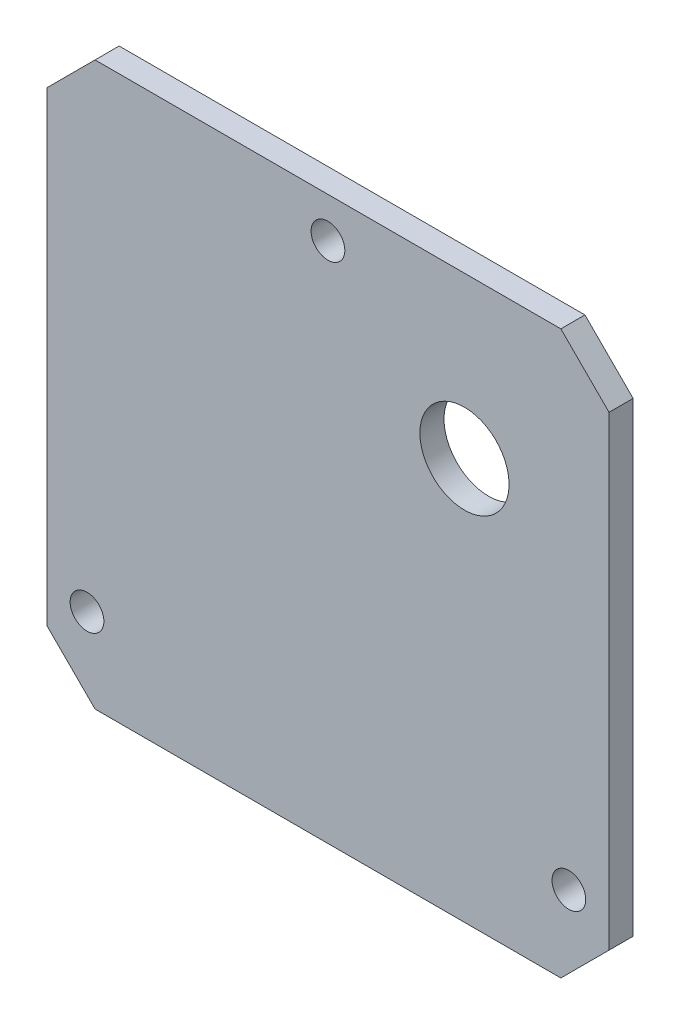
ISO-10303-21;
HEADER;
FILE_DESCRIPTION(('STEP AP214'),'2;1');
FILE_NAME('part.step','',(''),(''),'','','');
FILE_SCHEMA(('AUTOMOTIVE_DESIGN { 1 0 10303 214 1 1 1 1 }'));
ENDSEC;
DATA;
#1=APPLICATION_CONTEXT('core data for automotive mechanical design processes');
#2=APPLICATION_PROTOCOL_DEFINITION('international standard','automotive_design',2000,#1);
#3=PRODUCT_CONTEXT('',#1,'mechanical');
#4=PRODUCT('Part','Part','',(#3));
#5=PRODUCT_RELATED_PRODUCT_CATEGORY('part','',(#4));
#6=PRODUCT_DEFINITION_FORMATION('','',#4);
#7=PRODUCT_DEFINITION_CONTEXT('part definition',#1,'design');
#8=PRODUCT_DEFINITION('design','',#6,#7);
#9=PRODUCT_DEFINITION_SHAPE('','',#8);
#10=(LENGTH_UNIT() NAMED_UNIT(*) SI_UNIT(.MILLI.,.METRE.));
#11=(NAMED_UNIT(*) PLANE_ANGLE_UNIT() SI_UNIT($,.RADIAN.));
#12=(NAMED_UNIT(*) SI_UNIT($,.STERADIAN.) SOLID_ANGLE_UNIT());
#13=UNCERTAINTY_MEASURE_WITH_UNIT(LENGTH_MEASURE(1.E-05),#10,'distance_accuracy_value','');
#14=(GEOMETRIC_REPRESENTATION_CONTEXT(3) GLOBAL_UNCERTAINTY_ASSIGNED_CONTEXT((#13)) GLOBAL_UNIT_ASSIGNED_CONTEXT((#10,
#11,#12)) REPRESENTATION_CONTEXT('',''));
#15=CARTESIAN_POINT('',(0.,0.,0.));
#16=DIRECTION('',(0.,0.,1.));
#17=DIRECTION('',(1.,0.,0.));
#18=AXIS2_PLACEMENT_3D('',#15,#16,#17);
#19=CARTESIAN_POINT('',(-35.,-35.,3.));
#20=DIRECTION('',(1.,0.,0.));
#21=DIRECTION('',(0.,0.,-1.));
#22=AXIS2_PLACEMENT_3D('',#19,#20,#21);
#23=PLANE('',#22);
#24=DIRECTION('',(0.,-1.,0.));
#25=VECTOR('',#24,1.);
#26=CARTESIAN_POINT('',(-35.,-35.,0.));
#27=LINE('',#26,#25);
#28=CARTESIAN_POINT('',(-35.,29.,0.));
#29=VERTEX_POINT('',#28);
#30=CARTESIAN_POINT('',(-35.,-29.,0.));
#31=VERTEX_POINT('',#30);
#32=EDGE_CURVE('E131',#29,#31,#27,.T.);
#33=ORIENTED_EDGE('',*,*,#32,.T.);
#34=DIRECTION('',(0.,0.,1.));
#35=VECTOR('',#34,1.);
#36=CARTESIAN_POINT('',(-35.,-29.,3.));
#37=LINE('',#36,#35);
#38=CARTESIAN_POINT('',(-35.,-29.,3.));
#39=VERTEX_POINT('',#38);
#40=EDGE_CURVE('E109',#31,#39,#37,.T.);
#41=ORIENTED_EDGE('',*,*,#40,.T.);
#42=DIRECTION('',(0.,-1.,0.));
#43=VECTOR('',#42,1.);
#44=CARTESIAN_POINT('',(-35.,-35.,3.));
#45=LINE('',#44,#43);
#46=CARTESIAN_POINT('',(-35.,29.,3.));
#47=VERTEX_POINT('',#46);
#48=EDGE_CURVE('E141',#47,#39,#45,.T.);
#49=ORIENTED_EDGE('',*,*,#48,.F.);
#50=DIRECTION('',(0.,0.,-1.));
#51=VECTOR('',#50,1.);
#52=CARTESIAN_POINT('',(-35.,29.,3.));
#53=LINE('',#52,#51);
#54=EDGE_CURVE('E114',#47,#29,#53,.T.);
#55=ORIENTED_EDGE('',*,*,#54,.T.);
#56=EDGE_LOOP('',(#33,#41,#49,#55));
#57=FACE_BOUND('',#56,.T.);
#58=ADVANCED_FACE('F37',(#57),#23,.F.);
#59=CARTESIAN_POINT('',(35.,-35.,3.));
#60=DIRECTION('',(0.,1.,0.));
#61=DIRECTION('',(-1.,0.,0.));
#62=AXIS2_PLACEMENT_3D('',#59,#60,#61);
#63=PLANE('',#62);
#64=DIRECTION('',(1.,0.,0.));
#65=VECTOR('',#64,1.);
#66=CARTESIAN_POINT('',(35.,-35.,3.));
#67=LINE('',#66,#65);
#68=CARTESIAN_POINT('',(-29.,-35.,3.));
#69=VERTEX_POINT('',#68);
#70=CARTESIAN_POINT('',(29.,-35.,3.));
#71=VERTEX_POINT('',#70);
#72=EDGE_CURVE('E124',#69,#71,#67,.T.);
#73=ORIENTED_EDGE('',*,*,#72,.F.);
#74=DIRECTION('',(0.,0.,-1.));
#75=VECTOR('',#74,1.);
#76=CARTESIAN_POINT('',(-29.,-35.,3.));
#77=LINE('',#76,#75);
#78=CARTESIAN_POINT('',(-29.,-35.,0.));
#79=VERTEX_POINT('',#78);
#80=EDGE_CURVE('E108',#69,#79,#77,.T.);
#81=ORIENTED_EDGE('',*,*,#80,.T.);
#82=DIRECTION('',(1.,0.,0.));
#83=VECTOR('',#82,1.);
#84=CARTESIAN_POINT('',(35.,-35.,0.));
#85=LINE('',#84,#83);
#86=CARTESIAN_POINT('',(29.,-35.,0.));
#87=VERTEX_POINT('',#86);
#88=EDGE_CURVE('E121',#79,#87,#85,.T.);
#89=ORIENTED_EDGE('',*,*,#88,.T.);
#90=DIRECTION('',(0.,0.,1.));
#91=VECTOR('',#90,1.);
#92=CARTESIAN_POINT('',(29.,-35.,3.));
#93=LINE('',#92,#91);
#94=EDGE_CURVE('E126',#87,#71,#93,.T.);
#95=ORIENTED_EDGE('',*,*,#94,.T.);
#96=EDGE_LOOP('',(#73,#81,#89,#95));
#97=FACE_BOUND('',#96,.T.);
#98=ADVANCED_FACE('F120',(#97),#63,.F.);
#99=CARTESIAN_POINT('',(35.,-35.,3.));
#100=DIRECTION('',(-1.,0.,0.));
#101=DIRECTION('',(0.,0.,1.));
#102=AXIS2_PLACEMENT_3D('',#99,#100,#101);
#103=PLANE('',#102);
#104=DIRECTION('',(0.,1.,0.));
#105=VECTOR('',#104,1.);
#106=CARTESIAN_POINT('',(35.,-35.,3.));
#107=LINE('',#106,#105);
#108=CARTESIAN_POINT('',(35.,-29.,3.));
#109=VERTEX_POINT('',#108);
#110=CARTESIAN_POINT('',(35.,29.,3.));
#111=VERTEX_POINT('',#110);
#112=EDGE_CURVE('E167',#109,#111,#107,.T.);
#113=ORIENTED_EDGE('',*,*,#112,.F.);
#114=DIRECTION('',(0.,0.,-1.));
#115=VECTOR('',#114,1.);
#116=CARTESIAN_POINT('',(35.,-29.,3.));
#117=LINE('',#116,#115);
#118=CARTESIAN_POINT('',(35.,-29.,0.));
#119=VERTEX_POINT('',#118);
#120=EDGE_CURVE('E160',#109,#119,#117,.T.);
#121=ORIENTED_EDGE('',*,*,#120,.T.);
#122=DIRECTION('',(0.,1.,0.));
#123=VECTOR('',#122,1.);
#124=CARTESIAN_POINT('',(35.,-35.,0.));
#125=LINE('',#124,#123);
#126=CARTESIAN_POINT('',(35.,29.,0.));
#127=VERTEX_POINT('',#126);
#128=EDGE_CURVE('E130',#119,#127,#125,.T.);
#129=ORIENTED_EDGE('',*,*,#128,.T.);
#130=DIRECTION('',(0.,0.,1.));
#131=VECTOR('',#130,1.);
#132=CARTESIAN_POINT('',(35.,29.,3.));
#133=LINE('',#132,#131);
#134=EDGE_CURVE('E158',#127,#111,#133,.T.);
#135=ORIENTED_EDGE('',*,*,#134,.T.);
#136=EDGE_LOOP('',(#113,#121,#129,#135));
#137=FACE_BOUND('',#136,.T.);
#138=ADVANCED_FACE('F165',(#137),#103,.F.);
#139=CARTESIAN_POINT('',(35.,35.,3.));
#140=DIRECTION('',(0.,-1.,0.));
#141=DIRECTION('',(1.,0.,0.));
#142=AXIS2_PLACEMENT_3D('',#139,#140,#141);
#143=PLANE('',#142);
#144=DIRECTION('',(-1.,0.,0.));
#145=VECTOR('',#144,1.);
#146=CARTESIAN_POINT('',(35.,35.,3.));
#147=LINE('',#146,#145);
#148=CARTESIAN_POINT('',(29.,35.,3.));
#149=VERTEX_POINT('',#148);
#150=CARTESIAN_POINT('',(-29.,35.,3.));
#151=VERTEX_POINT('',#150);
#152=EDGE_CURVE('E142',#149,#151,#147,.T.);
#153=ORIENTED_EDGE('',*,*,#152,.F.);
#154=DIRECTION('',(0.,0.,-1.));
#155=VECTOR('',#154,1.);
#156=CARTESIAN_POINT('',(29.,35.,3.));
#157=LINE('',#156,#155);
#158=CARTESIAN_POINT('',(29.,35.,0.));
#159=VERTEX_POINT('',#158);
#160=EDGE_CURVE('E11',#149,#159,#157,.T.);
#161=ORIENTED_EDGE('',*,*,#160,.T.);
#162=DIRECTION('',(-1.,0.,0.));
#163=VECTOR('',#162,1.);
#164=CARTESIAN_POINT('',(35.,35.,0.));
#165=LINE('',#164,#163);
#166=CARTESIAN_POINT('',(-29.,35.,0.));
#167=VERTEX_POINT('',#166);
#168=EDGE_CURVE('E134',#159,#167,#165,.T.);
#169=ORIENTED_EDGE('',*,*,#168,.T.);
#170=DIRECTION('',(0.,0.,1.));
#171=VECTOR('',#170,1.);
#172=CARTESIAN_POINT('',(-29.,35.,3.));
#173=LINE('',#172,#171);
#174=EDGE_CURVE('E46',#167,#151,#173,.T.);
#175=ORIENTED_EDGE('',*,*,#174,.T.);
#176=EDGE_LOOP('',(#153,#161,#169,#175));
#177=FACE_BOUND('',#176,.T.);
#178=ADVANCED_FACE('F174',(#177),#143,.F.);
#179=CARTESIAN_POINT('',(0.,0.,3.));
#180=DIRECTION('',(0.,0.,1.));
#181=DIRECTION('',(1.,0.,0.));
#182=AXIS2_PLACEMENT_3D('',#179,#180,#181);
#183=PLANE('',#182);
#184=CARTESIAN_POINT('',(17.,15.,3.));
#185=DIRECTION('',(0.,0.,-1.));
#186=DIRECTION('',(-1.,0.,0.));
#187=AXIS2_PLACEMENT_3D('',#184,#185,#186);
#188=CIRCLE('',#187,5.55);
#189=CARTESIAN_POINT('',(11.45,15.,3.));
#190=VERTEX_POINT('',#189);
#191=EDGE_CURVE('E185',#190,#190,#188,.T.);
#192=ORIENTED_EDGE('',*,*,#191,.T.);
#193=EDGE_LOOP('',(#192));
#194=FACE_BOUND('',#193,.T.);
#195=CARTESIAN_POINT('',(0.,30.,3.));
#196=DIRECTION('',(0.,0.,-1.));
#197=DIRECTION('',(-1.,0.,0.));
#198=AXIS2_PLACEMENT_3D('',#195,#196,#197);
#199=CIRCLE('',#198,2.1);
#200=CARTESIAN_POINT('',(-2.09999999999998,30.,3.));
#201=VERTEX_POINT('',#200);
#202=EDGE_CURVE('E136',#201,#201,#199,.T.);
#203=ORIENTED_EDGE('',*,*,#202,.T.);
#204=EDGE_LOOP('',(#203));
#205=FACE_BOUND('',#204,.T.);
#206=CARTESIAN_POINT('',(30.,-25.,3.));
#207=DIRECTION('',(0.,0.,-1.));
#208=DIRECTION('',(-1.,0.,0.));
#209=AXIS2_PLACEMENT_3D('',#206,#207,#208);
#210=CIRCLE('',#209,2.1);
#211=CARTESIAN_POINT('',(27.9,-25.,3.));
#212=VERTEX_POINT('',#211);
#213=EDGE_CURVE('E191',#212,#212,#210,.T.);
#214=ORIENTED_EDGE('',*,*,#213,.T.);
#215=EDGE_LOOP('',(#214));
#216=FACE_BOUND('',#215,.T.);
#217=CARTESIAN_POINT('',(-30.,-25.,3.));
#218=DIRECTION('',(0.,0.,-1.));
#219=DIRECTION('',(-1.,0.,0.));
#220=AXIS2_PLACEMENT_3D('',#217,#218,#219);
#221=CIRCLE('',#220,2.1);
#222=CARTESIAN_POINT('',(-32.1,-25.,3.));
#223=VERTEX_POINT('',#222);
#224=EDGE_CURVE('E184',#223,#223,#221,.T.);
#225=ORIENTED_EDGE('',*,*,#224,.T.);
#226=EDGE_LOOP('',(#225));
#227=FACE_BOUND('',#226,.T.);
#228=ORIENTED_EDGE('',*,*,#48,.T.);
#229=DIRECTION('',(-0.707106781186546,0.707106781186549,0.));
#230=VECTOR('',#229,1.);
#231=CARTESIAN_POINT('',(-32.0000000000001,-31.9999999999999,3.));
#232=LINE('',#231,#230);
#233=EDGE_CURVE('E156',#39,#69,#232,.F.);
#234=ORIENTED_EDGE('',*,*,#233,.T.);
#235=ORIENTED_EDGE('',*,*,#72,.T.);
#236=DIRECTION('',(-0.707106781186549,-0.707106781186546,0.));
#237=VECTOR('',#236,1.);
#238=CARTESIAN_POINT('',(31.9999999999999,-32.0000000000001,3.));
#239=LINE('',#238,#237);
#240=EDGE_CURVE('E154',#71,#109,#239,.F.);
#241=ORIENTED_EDGE('',*,*,#240,.T.);
#242=ORIENTED_EDGE('',*,*,#112,.T.);
#243=DIRECTION('',(0.707106781186546,-0.707106781186549,0.));
#244=VECTOR('',#243,1.);
#245=CARTESIAN_POINT('',(32.0000000000001,31.9999999999999,3.));
#246=LINE('',#245,#244);
#247=EDGE_CURVE('E59',#111,#149,#246,.F.);
#248=ORIENTED_EDGE('',*,*,#247,.T.);
#249=ORIENTED_EDGE('',*,*,#152,.T.);
#250=DIRECTION('',(0.707106781186549,0.707106781186546,0.));
#251=VECTOR('',#250,1.);
#252=CARTESIAN_POINT('',(-31.9999999999999,32.,3.));
#253=LINE('',#252,#251);
#254=EDGE_CURVE('E151',#151,#47,#253,.F.);
#255=ORIENTED_EDGE('',*,*,#254,.T.);
#256=EDGE_LOOP('',(#228,#234,#235,#241,#242,#248,#249,#255));
#257=FACE_BOUND('',#256,.T.);
#258=ADVANCED_FACE('F205',(#194,#205,#216,#227,#257),#183,.T.);
#259=CARTESIAN_POINT('',(0.,0.,0.));
#260=DIRECTION('',(0.,0.,1.));
#261=DIRECTION('',(1.,0.,0.));
#262=AXIS2_PLACEMENT_3D('',#259,#260,#261);
#263=PLANE('',#262);
#264=CARTESIAN_POINT('',(17.,15.,0.));
#265=DIRECTION('',(0.,0.,-1.));
#266=DIRECTION('',(-1.,0.,0.));
#267=AXIS2_PLACEMENT_3D('',#264,#265,#266);
#268=CIRCLE('',#267,5.55);
#269=CARTESIAN_POINT('',(11.45,15.,0.));
#270=VERTEX_POINT('',#269);
#271=EDGE_CURVE('E199',#270,#270,#268,.T.);
#272=ORIENTED_EDGE('',*,*,#271,.F.);
#273=EDGE_LOOP('',(#272));
#274=FACE_BOUND('',#273,.T.);
#275=CARTESIAN_POINT('',(0.,30.,0.));
#276=DIRECTION('',(0.,0.,-1.));
#277=DIRECTION('',(-1.,0.,0.));
#278=AXIS2_PLACEMENT_3D('',#275,#276,#277);
#279=CIRCLE('',#278,2.1);
#280=CARTESIAN_POINT('',(-2.09999999999998,30.,0.));
#281=VERTEX_POINT('',#280);
#282=EDGE_CURVE('E194',#281,#281,#279,.T.);
#283=ORIENTED_EDGE('',*,*,#282,.F.);
#284=EDGE_LOOP('',(#283));
#285=FACE_BOUND('',#284,.T.);
#286=CARTESIAN_POINT('',(30.,-25.,0.));
#287=DIRECTION('',(0.,0.,-1.));
#288=DIRECTION('',(-1.,0.,0.));
#289=AXIS2_PLACEMENT_3D('',#286,#287,#288);
#290=CIRCLE('',#289,2.1);
#291=CARTESIAN_POINT('',(27.9,-25.,0.));
#292=VERTEX_POINT('',#291);
#293=EDGE_CURVE('E188',#292,#292,#290,.T.);
#294=ORIENTED_EDGE('',*,*,#293,.F.);
#295=EDGE_LOOP('',(#294));
#296=FACE_BOUND('',#295,.T.);
#297=CARTESIAN_POINT('',(-30.,-25.,0.));
#298=DIRECTION('',(0.,0.,-1.));
#299=DIRECTION('',(-1.,0.,0.));
#300=AXIS2_PLACEMENT_3D('',#297,#298,#299);
#301=CIRCLE('',#300,2.1);
#302=CARTESIAN_POINT('',(-32.1,-25.,0.));
#303=VERTEX_POINT('',#302);
#304=EDGE_CURVE('E181',#303,#303,#301,.T.);
#305=ORIENTED_EDGE('',*,*,#304,.F.);
#306=EDGE_LOOP('',(#305));
#307=FACE_BOUND('',#306,.T.);
#308=ORIENTED_EDGE('',*,*,#88,.F.);
#309=DIRECTION('',(0.707106781186546,-0.707106781186549,0.));
#310=VECTOR('',#309,1.);
#311=CARTESIAN_POINT('',(-29.,-35.,0.));
#312=LINE('',#311,#310);
#313=EDGE_CURVE('E104',#79,#31,#312,.F.);
#314=ORIENTED_EDGE('',*,*,#313,.T.);
#315=ORIENTED_EDGE('',*,*,#32,.F.);
#316=DIRECTION('',(-0.707106781186549,-0.707106781186546,0.));
#317=VECTOR('',#316,1.);
#318=CARTESIAN_POINT('',(-35.,29.,0.));
#319=LINE('',#318,#317);
#320=EDGE_CURVE('E125',#29,#167,#319,.F.);
#321=ORIENTED_EDGE('',*,*,#320,.T.);
#322=ORIENTED_EDGE('',*,*,#168,.F.);
#323=DIRECTION('',(-0.707106781186546,0.707106781186549,0.));
#324=VECTOR('',#323,1.);
#325=CARTESIAN_POINT('',(29.,35.,0.));
#326=LINE('',#325,#324);
#327=EDGE_CURVE('E145',#159,#127,#326,.F.);
#328=ORIENTED_EDGE('',*,*,#327,.T.);
#329=ORIENTED_EDGE('',*,*,#128,.F.);
#330=DIRECTION('',(0.707106781186549,0.707106781186546,0.));
#331=VECTOR('',#330,1.);
#332=CARTESIAN_POINT('',(35.,-29.,0.));
#333=LINE('',#332,#331);
#334=EDGE_CURVE('E115',#119,#87,#333,.F.);
#335=ORIENTED_EDGE('',*,*,#334,.T.);
#336=EDGE_LOOP('',(#308,#314,#315,#321,#322,#328,#329,#335));
#337=FACE_BOUND('',#336,.T.);
#338=ADVANCED_FACE('F128',(#274,#285,#296,#307,#337),#263,.F.);
#339=CARTESIAN_POINT('',(-29.,-35.,3.));
#340=DIRECTION('',(0.707106781186549,0.707106781186546,0.));
#341=DIRECTION('',(0.,0.,-1.));
#342=AXIS2_PLACEMENT_3D('',#339,#340,#341);
#343=PLANE('',#342);
#344=ORIENTED_EDGE('',*,*,#233,.F.);
#345=ORIENTED_EDGE('',*,*,#40,.F.);
#346=ORIENTED_EDGE('',*,*,#313,.F.);
#347=ORIENTED_EDGE('',*,*,#80,.F.);
#348=EDGE_LOOP('',(#344,#345,#346,#347));
#349=FACE_BOUND('',#348,.T.);
#350=ADVANCED_FACE('F107',(#349),#343,.F.);
#351=CARTESIAN_POINT('',(35.,-29.,3.));
#352=DIRECTION('',(-0.707106781186546,0.707106781186549,0.));
#353=DIRECTION('',(0.,0.,-1.));
#354=AXIS2_PLACEMENT_3D('',#351,#352,#353);
#355=PLANE('',#354);
#356=ORIENTED_EDGE('',*,*,#240,.F.);
#357=ORIENTED_EDGE('',*,*,#94,.F.);
#358=ORIENTED_EDGE('',*,*,#334,.F.);
#359=ORIENTED_EDGE('',*,*,#120,.F.);
#360=EDGE_LOOP('',(#356,#357,#358,#359));
#361=FACE_BOUND('',#360,.T.);
#362=ADVANCED_FACE('F253',(#361),#355,.F.);
#363=CARTESIAN_POINT('',(29.,35.,3.));
#364=DIRECTION('',(-0.707106781186549,-0.707106781186546,0.));
#365=DIRECTION('',(0.,0.,-1.));
#366=AXIS2_PLACEMENT_3D('',#363,#364,#365);
#367=PLANE('',#366);
#368=ORIENTED_EDGE('',*,*,#247,.F.);
#369=ORIENTED_EDGE('',*,*,#134,.F.);
#370=ORIENTED_EDGE('',*,*,#327,.F.);
#371=ORIENTED_EDGE('',*,*,#160,.F.);
#372=EDGE_LOOP('',(#368,#369,#370,#371));
#373=FACE_BOUND('',#372,.T.);
#374=ADVANCED_FACE('F173',(#373),#367,.F.);
#375=CARTESIAN_POINT('',(-35.,29.,3.));
#376=DIRECTION('',(0.707106781186546,-0.707106781186549,0.));
#377=DIRECTION('',(0.,0.,-1.));
#378=AXIS2_PLACEMENT_3D('',#375,#376,#377);
#379=PLANE('',#378);
#380=ORIENTED_EDGE('',*,*,#254,.F.);
#381=ORIENTED_EDGE('',*,*,#174,.F.);
#382=ORIENTED_EDGE('',*,*,#320,.F.);
#383=ORIENTED_EDGE('',*,*,#54,.F.);
#384=EDGE_LOOP('',(#380,#381,#382,#383));
#385=FACE_BOUND('',#384,.T.);
#386=ADVANCED_FACE('F40',(#385),#379,.F.);
#387=CARTESIAN_POINT('',(-30.,-25.,3.));
#388=DIRECTION('',(0.,0.,-1.));
#389=DIRECTION('',(-1.,0.,0.));
#390=AXIS2_PLACEMENT_3D('',#387,#388,#389);
#391=CYLINDRICAL_SURFACE('',#390,2.1);
#392=ORIENTED_EDGE('',*,*,#224,.F.);
#393=EDGE_LOOP('',(#392));
#394=FACE_BOUND('',#393,.T.);
#395=ORIENTED_EDGE('',*,*,#304,.T.);
#396=EDGE_LOOP('',(#395));
#397=FACE_BOUND('',#396,.T.);
#398=ADVANCED_FACE('F224',(#394,#397),#391,.F.);
#399=CARTESIAN_POINT('',(30.,-25.,3.));
#400=DIRECTION('',(0.,0.,-1.));
#401=DIRECTION('',(-1.,0.,0.));
#402=AXIS2_PLACEMENT_3D('',#399,#400,#401);
#403=CYLINDRICAL_SURFACE('',#402,2.1);
#404=ORIENTED_EDGE('',*,*,#213,.F.);
#405=EDGE_LOOP('',(#404));
#406=FACE_BOUND('',#405,.T.);
#407=ORIENTED_EDGE('',*,*,#293,.T.);
#408=EDGE_LOOP('',(#407));
#409=FACE_BOUND('',#408,.T.);
#410=ADVANCED_FACE('F226',(#406,#409),#403,.F.);
#411=CARTESIAN_POINT('',(0.,30.,3.));
#412=DIRECTION('',(0.,0.,-1.));
#413=DIRECTION('',(-1.,0.,0.));
#414=AXIS2_PLACEMENT_3D('',#411,#412,#413);
#415=CYLINDRICAL_SURFACE('',#414,2.1);
#416=ORIENTED_EDGE('',*,*,#202,.F.);
#417=EDGE_LOOP('',(#416));
#418=FACE_BOUND('',#417,.T.);
#419=ORIENTED_EDGE('',*,*,#282,.T.);
#420=EDGE_LOOP('',(#419));
#421=FACE_BOUND('',#420,.T.);
#422=ADVANCED_FACE('F211',(#418,#421),#415,.F.);
#423=CARTESIAN_POINT('',(17.,15.,3.));
#424=DIRECTION('',(0.,0.,-1.));
#425=DIRECTION('',(-1.,0.,0.));
#426=AXIS2_PLACEMENT_3D('',#423,#424,#425);
#427=CYLINDRICAL_SURFACE('',#426,5.55);
#428=ORIENTED_EDGE('',*,*,#191,.F.);
#429=EDGE_LOOP('',(#428));
#430=FACE_BOUND('',#429,.T.);
#431=ORIENTED_EDGE('',*,*,#271,.T.);
#432=EDGE_LOOP('',(#431));
#433=FACE_BOUND('',#432,.T.);
#434=ADVANCED_FACE('F208',(#430,#433),#427,.F.);
#435=CLOSED_SHELL('',(#58,#98,#138,#178,#258,#338,#350,#362,#374,#386,#398,#410,#422,#434));
#436=MANIFOLD_SOLID_BREP('B2',#435);
#437=ADVANCED_BREP_SHAPE_REPRESENTATION('',(#18,#436),#14);
#438=SHAPE_DEFINITION_REPRESENTATION(#9,#437);
ENDSEC;
END-ISO-10303-21;
